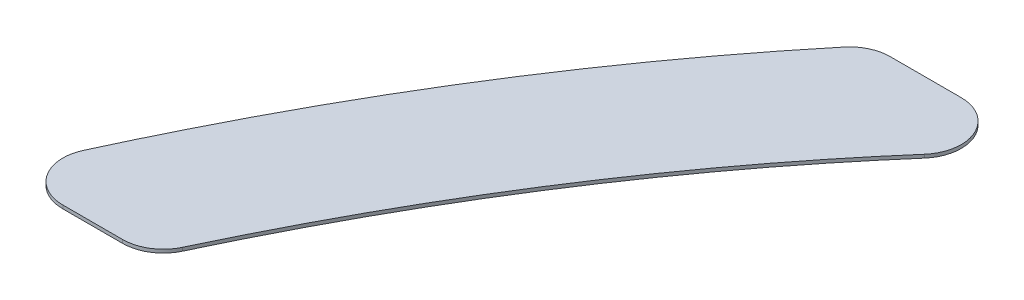
ISO-10303-21;
HEADER;
FILE_DESCRIPTION(('STEP AP214'),'2;1');
FILE_NAME('part.step','',(''),(''),'','','');
FILE_SCHEMA(('AUTOMOTIVE_DESIGN { 1 0 10303 214 1 1 1 1 }'));
ENDSEC;
DATA;
#1=APPLICATION_CONTEXT('core data for automotive mechanical design processes');
#2=APPLICATION_PROTOCOL_DEFINITION('international standard','automotive_design',2000,#1);
#3=PRODUCT_CONTEXT('',#1,'mechanical');
#4=PRODUCT('Part','Part','',(#3));
#5=PRODUCT_RELATED_PRODUCT_CATEGORY('part','',(#4));
#6=PRODUCT_DEFINITION_FORMATION('','',#4);
#7=PRODUCT_DEFINITION_CONTEXT('part definition',#1,'design');
#8=PRODUCT_DEFINITION('design','',#6,#7);
#9=PRODUCT_DEFINITION_SHAPE('','',#8);
#10=(LENGTH_UNIT() NAMED_UNIT(*) SI_UNIT(.MILLI.,.METRE.));
#11=(NAMED_UNIT(*) PLANE_ANGLE_UNIT() SI_UNIT($,.RADIAN.));
#12=(NAMED_UNIT(*) SI_UNIT($,.STERADIAN.) SOLID_ANGLE_UNIT());
#13=UNCERTAINTY_MEASURE_WITH_UNIT(LENGTH_MEASURE(1.E-05),#10,'distance_accuracy_value','');
#14=(GEOMETRIC_REPRESENTATION_CONTEXT(3) GLOBAL_UNCERTAINTY_ASSIGNED_CONTEXT((#13)) GLOBAL_UNIT_ASSIGNED_CONTEXT((#10,
#11,#12)) REPRESENTATION_CONTEXT('',''));
#15=CARTESIAN_POINT('',(0.,0.,0.));
#16=DIRECTION('',(0.,0.,1.));
#17=DIRECTION('',(1.,0.,0.));
#18=AXIS2_PLACEMENT_3D('',#15,#16,#17);
#19=CARTESIAN_POINT('',(955.237576402872,505.5,-738.));
#20=DIRECTION('',(0.,1.,0.));
#21=DIRECTION('',(0.,0.,1.));
#22=AXIS2_PLACEMENT_3D('',#19,#20,#21);
#23=CYLINDRICAL_SURFACE('',#22,12.);
#24=CARTESIAN_POINT('',(955.237576402872,505.,-738.));
#25=DIRECTION('',(0.,-1.,0.));
#26=DIRECTION('',(0.,0.,1.));
#27=AXIS2_PLACEMENT_3D('',#24,#25,#26);
#28=CIRCLE('',#27,12.);
#29=CARTESIAN_POINT('',(945.985939721077,505.,-745.642461560785));
#30=VERTEX_POINT('',#29);
#31=CARTESIAN_POINT('',(955.237576402872,505.,-750.));
#32=VERTEX_POINT('',#31);
#33=EDGE_CURVE('E30',#30,#32,#28,.T.);
#34=ORIENTED_EDGE('',*,*,#33,.F.);
#35=DIRECTION('',(0.,-1.,0.));
#36=VECTOR('',#35,1.);
#37=CARTESIAN_POINT('',(945.985939721077,506.,-745.642461560785));
#38=LINE('',#37,#36);
#39=CARTESIAN_POINT('',(945.985939721077,506.,-745.642461560785));
#40=VERTEX_POINT('',#39);
#41=EDGE_CURVE('E128',#40,#30,#38,.T.);
#42=ORIENTED_EDGE('',*,*,#41,.F.);
#43=CARTESIAN_POINT('',(955.237576402872,506.,-738.));
#44=DIRECTION('',(0.,1.,0.));
#45=DIRECTION('',(0.,0.,1.));
#46=AXIS2_PLACEMENT_3D('',#43,#44,#45);
#47=CIRCLE('',#46,12.);
#48=CARTESIAN_POINT('',(955.237576402872,506.,-750.));
#49=VERTEX_POINT('',#48);
#50=EDGE_CURVE('E170',#49,#40,#47,.T.);
#51=ORIENTED_EDGE('',*,*,#50,.F.);
#52=DIRECTION('',(0.,1.,0.));
#53=VECTOR('',#52,1.);
#54=CARTESIAN_POINT('',(955.237576402872,505.,-750.));
#55=LINE('',#54,#53);
#56=EDGE_CURVE('E163',#32,#49,#55,.T.);
#57=ORIENTED_EDGE('',*,*,#56,.F.);
#58=EDGE_LOOP('',(#34,#42,#51,#57));
#59=FACE_BOUND('',#58,.T.);
#60=ADVANCED_FACE('F17',(#59),#23,.T.);
#61=CARTESIAN_POINT('',(976.208661184801,505.5,-738.));
#62=DIRECTION('',(0.,1.,0.));
#63=DIRECTION('',(0.,0.,1.));
#64=AXIS2_PLACEMENT_3D('',#61,#62,#63);
#65=CYLINDRICAL_SURFACE('',#64,12.);
#66=CARTESIAN_POINT('',(976.208661184801,505.,-738.));
#67=DIRECTION('',(0.,-1.,0.));
#68=DIRECTION('',(0.,0.,1.));
#69=AXIS2_PLACEMENT_3D('',#66,#67,#68);
#70=CIRCLE('',#69,12.);
#71=CARTESIAN_POINT('',(976.208661184801,505.,-750.));
#72=VERTEX_POINT('',#71);
#73=CARTESIAN_POINT('',(985.265058399663,505.,-730.127156200797));
#74=VERTEX_POINT('',#73);
#75=EDGE_CURVE('E11',#72,#74,#70,.T.);
#76=ORIENTED_EDGE('',*,*,#75,.F.);
#77=DIRECTION('',(0.,-1.,0.));
#78=VECTOR('',#77,1.);
#79=CARTESIAN_POINT('',(976.208661184801,505.,-750.));
#80=LINE('',#79,#78);
#81=CARTESIAN_POINT('',(976.208661184801,506.,-750.));
#82=VERTEX_POINT('',#81);
#83=EDGE_CURVE('E174',#82,#72,#80,.T.);
#84=ORIENTED_EDGE('',*,*,#83,.F.);
#85=CARTESIAN_POINT('',(976.208661184801,506.,-738.));
#86=DIRECTION('',(0.,1.,0.));
#87=DIRECTION('',(0.,0.,1.));
#88=AXIS2_PLACEMENT_3D('',#85,#86,#87);
#89=CIRCLE('',#88,12.);
#90=CARTESIAN_POINT('',(985.265058399663,506.,-730.127156200797));
#91=VERTEX_POINT('',#90);
#92=EDGE_CURVE('E144',#91,#82,#89,.T.);
#93=ORIENTED_EDGE('',*,*,#92,.F.);
#94=DIRECTION('',(0.,1.,0.));
#95=VECTOR('',#94,1.);
#96=CARTESIAN_POINT('',(985.265058399663,505.,-730.127156200797));
#97=LINE('',#96,#95);
#98=EDGE_CURVE('E145',#74,#91,#97,.T.);
#99=ORIENTED_EDGE('',*,*,#98,.F.);
#100=EDGE_LOOP('',(#76,#84,#93,#99));
#101=FACE_BOUND('',#100,.T.);
#102=ADVANCED_FACE('F220',(#101),#65,.T.);
#103=CARTESIAN_POINT('',(871.073432562076,505.5,-602.));
#104=DIRECTION('',(0.,1.,0.));
#105=DIRECTION('',(0.,0.,1.));
#106=AXIS2_PLACEMENT_3D('',#103,#104,#105);
#107=CYLINDRICAL_SURFACE('',#106,12.);
#108=CARTESIAN_POINT('',(871.073432562076,505.,-602.));
#109=DIRECTION('',(0.,-1.,0.));
#110=DIRECTION('',(0.,0.,1.));
#111=AXIS2_PLACEMENT_3D('',#108,#109,#110);
#112=CIRCLE('',#111,12.);
#113=CARTESIAN_POINT('',(871.073432562076,505.,-590.));
#114=VERTEX_POINT('',#113);
#115=CARTESIAN_POINT('',(860.166764917188,505.,-607.004458100929));
#116=VERTEX_POINT('',#115);
#117=EDGE_CURVE('E110',#114,#116,#112,.T.);
#118=ORIENTED_EDGE('',*,*,#117,.F.);
#119=DIRECTION('',(0.,-1.,0.));
#120=VECTOR('',#119,1.);
#121=CARTESIAN_POINT('',(871.073432562076,505.,-590.));
#122=LINE('',#121,#120);
#123=CARTESIAN_POINT('',(871.073432562076,506.,-590.));
#124=VERTEX_POINT('',#123);
#125=EDGE_CURVE('E126',#124,#114,#122,.T.);
#126=ORIENTED_EDGE('',*,*,#125,.F.);
#127=CARTESIAN_POINT('',(871.073432562076,506.,-602.));
#128=DIRECTION('',(0.,1.,0.));
#129=DIRECTION('',(0.,0.,1.));
#130=AXIS2_PLACEMENT_3D('',#127,#128,#129);
#131=CIRCLE('',#130,12.);
#132=CARTESIAN_POINT('',(860.166764917188,506.,-607.00445810093));
#133=VERTEX_POINT('',#132);
#134=EDGE_CURVE('E111',#133,#124,#131,.T.);
#135=ORIENTED_EDGE('',*,*,#134,.F.);
#136=DIRECTION('',(0.,1.,0.));
#137=VECTOR('',#136,1.);
#138=CARTESIAN_POINT('',(860.166764917188,505.,-607.00445810093));
#139=LINE('',#138,#137);
#140=EDGE_CURVE('E155',#116,#133,#139,.T.);
#141=ORIENTED_EDGE('',*,*,#140,.F.);
#142=EDGE_LOOP('',(#118,#126,#135,#141));
#143=FACE_BOUND('',#142,.T.);
#144=ADVANCED_FACE('F215',(#143),#107,.T.);
#145=CARTESIAN_POINT('',(888.719576178788,505.5,-602.));
#146=DIRECTION('',(0.,1.,0.));
#147=DIRECTION('',(0.,0.,1.));
#148=AXIS2_PLACEMENT_3D('',#145,#146,#147);
#149=CYLINDRICAL_SURFACE('',#148,12.);
#150=CARTESIAN_POINT('',(888.719576178788,505.,-602.));
#151=DIRECTION('',(0.,-1.,0.));
#152=DIRECTION('',(0.,0.,1.));
#153=AXIS2_PLACEMENT_3D('',#150,#151,#152);
#154=CIRCLE('',#153,12.);
#155=CARTESIAN_POINT('',(899.573311030838,505.,-596.881754230071));
#156=VERTEX_POINT('',#155);
#157=CARTESIAN_POINT('',(888.719576178788,505.,-590.));
#158=VERTEX_POINT('',#157);
#159=EDGE_CURVE('E99',#156,#158,#154,.T.);
#160=ORIENTED_EDGE('',*,*,#159,.F.);
#161=DIRECTION('',(0.,-1.,0.));
#162=VECTOR('',#161,1.);
#163=CARTESIAN_POINT('',(899.573311030838,506.,-596.881754230071));
#164=LINE('',#163,#162);
#165=CARTESIAN_POINT('',(899.573311030838,506.,-596.881754230071));
#166=VERTEX_POINT('',#165);
#167=EDGE_CURVE('E139',#166,#156,#164,.T.);
#168=ORIENTED_EDGE('',*,*,#167,.F.);
#169=CARTESIAN_POINT('',(888.719576178788,506.,-602.));
#170=DIRECTION('',(0.,1.,0.));
#171=DIRECTION('',(0.,0.,1.));
#172=AXIS2_PLACEMENT_3D('',#169,#170,#171);
#173=CIRCLE('',#172,12.);
#174=CARTESIAN_POINT('',(888.719576178788,506.,-590.));
#175=VERTEX_POINT('',#174);
#176=EDGE_CURVE('E116',#175,#166,#173,.T.);
#177=ORIENTED_EDGE('',*,*,#176,.F.);
#178=DIRECTION('',(0.,1.,0.));
#179=VECTOR('',#178,1.);
#180=CARTESIAN_POINT('',(888.719576178788,505.,-590.));
#181=LINE('',#180,#179);
#182=EDGE_CURVE('E114',#158,#175,#181,.T.);
#183=ORIENTED_EDGE('',*,*,#182,.F.);
#184=EDGE_LOOP('',(#160,#168,#177,#183));
#185=FACE_BOUND('',#184,.T.);
#186=ADVANCED_FACE('F115',(#185),#149,.T.);
#187=CARTESIAN_POINT('',(0.,505.,0.));
#188=DIRECTION('',(0.,1.,0.));
#189=DIRECTION('',(1.,0.,0.));
#190=AXIS2_PLACEMENT_3D('',#187,#188,#189);
#191=PLANE('',#190);
#192=CARTESIAN_POINT('',(825.006522365139,505.,-344.676532488364));
#193=CARTESIAN_POINT('',(825.502071576371,505.,-347.609970859946));
#194=CARTESIAN_POINT('',(826.514492213466,505.,-353.489713475438));
#195=CARTESIAN_POINT('',(828.273533808435,505.,-363.324582214981));
#196=CARTESIAN_POINT('',(830.651391723599,505.,-376.045663642099));
#197=CARTESIAN_POINT('',(833.747456429881,505.,-391.621543043858));
#198=CARTESIAN_POINT('',(837.483450045872,505.,-409.103183332899));
#199=CARTESIAN_POINT('',(841.486505540497,505.,-426.544472916345));
#200=CARTESIAN_POINT('',(845.774013518538,505.,-443.954609379996));
#201=CARTESIAN_POINT('',(851.105430867338,505.,-464.155658786559));
#202=CARTESIAN_POINT('',(861.558508139477,505.,-500.521160412346));
#203=CARTESIAN_POINT('',(872.863834634074,505.,-533.518021096127));
#204=CARTESIAN_POINT('',(883.558054688417,505.,-560.331774609759));
#205=CARTESIAN_POINT('',(887.357800806862,505.,-569.541557639466));
#206=CARTESIAN_POINT('',(892.477568878219,505.,-581.473019758271));
#207=CARTESIAN_POINT('',(900.72435084607,505.,-599.640127057022));
#208=CARTESIAN_POINT('',(910.490682875014,505.,-619.304553189258));
#209=CARTESIAN_POINT('',(923.844740427881,505.,-643.841311183101));
#210=CARTESIAN_POINT('',(939.320335597391,505.,-669.51622660218));
#211=CARTESIAN_POINT('',(956.39364097684,505.,-694.171473634577));
#212=CARTESIAN_POINT('',(977.346769521141,505.,-721.399321829088));
#213=CARTESIAN_POINT('',(992.105926782801,505.,-738.23099025863));
#214=CARTESIAN_POINT('',(1003.47790187698,505.,-750.));
#215=B_SPLINE_CURVE_WITH_KNOTS('',3,(#192,#193,#194,#195,#196,#197,#198,#199,#200,#201,#202,
#203,#204,#205,#206,#207,#208,#209,#210,#211,#212,#213,#214),.UNSPECIFIED.,.F.,.F.,(4,1,1,1,1,1,
1,1,1,1,1,1,1,1,1,1,1,1,1,1,4),(0.,0.0198469540453557,0.0398023279099142,0.0666516046742607,
0.106181617890233,0.145742806752709,0.185906782046108,0.225557415669375,0.265358061934929,
0.325279072167063,0.477967126125197,0.49787596302009,0.517837003226265,0.544435965517352,
0.584485936496442,0.650928780005736,0.690868861182268,0.770831386087473,0.850825035250476,
0.890825141233141,1.),.UNSPECIFIED.);
#216=EDGE_CURVE('E105',#156,#74,#215,.T.);
#217=ORIENTED_EDGE('',*,*,#216,.F.);
#218=ORIENTED_EDGE('',*,*,#159,.T.);
#219=DIRECTION('',(1.,0.,0.));
#220=VECTOR('',#219,1.);
#221=CARTESIAN_POINT('',(0.,505.,-590.));
#222=LINE('',#221,#220);
#223=EDGE_CURVE('E103',#114,#158,#222,.T.);
#224=ORIENTED_EDGE('',*,*,#223,.F.);
#225=ORIENTED_EDGE('',*,*,#117,.T.);
#226=CARTESIAN_POINT('',(949.622839074963,505.,-750.));
#227=CARTESIAN_POINT('',(948.181651482879,505.,-748.290896013329));
#228=CARTESIAN_POINT('',(943.517373824289,505.,-742.692036027472));
#229=CARTESIAN_POINT('',(935.596348013565,505.,-732.796931963177));
#230=CARTESIAN_POINT('',(927.357452401453,505.,-721.903253368827));
#231=CARTESIAN_POINT('',(920.439413386482,505.,-712.320573569399));
#232=CARTESIAN_POINT('',(915.533414579631,505.,-705.283306887266));
#233=CARTESIAN_POINT('',(910.730648345717,505.,-698.191566717435));
#234=CARTESIAN_POINT('',(906.026129482516,505.,-691.040701027744));
#235=CARTESIAN_POINT('',(900.870928336081,505.,-682.928791147231));
#236=CARTESIAN_POINT('',(895.844019837568,505.,-674.741572245518));
#237=CARTESIAN_POINT('',(890.950116031723,505.,-666.49211748031));
#238=CARTESIAN_POINT('',(883.021464626893,505.,-652.65793836365));
#239=CARTESIAN_POINT('',(875.732647086845,505.,-639.028907763579));
#240=CARTESIAN_POINT('',(864.878708233502,505.,-617.371719998699));
#241=CARTESIAN_POINT('',(854.705502760165,505.,-595.38274812104));
#242=CARTESIAN_POINT('',(845.299994293779,505.,-572.580742200096));
#243=CARTESIAN_POINT('',(839.606242102918,505.,-557.816290796022));
#244=CARTESIAN_POINT('',(835.961614997108,505.,-548.041779910277));
#245=CARTESIAN_POINT('',(831.386466490733,505.,-535.280580154532));
#246=CARTESIAN_POINT('',(826.037331500085,505.,-519.493232672379));
#247=CARTESIAN_POINT('',(821.013206386271,505.,-503.624479559208));
#248=CARTESIAN_POINT('',(816.258267212226,505.,-487.736915010618));
#249=CARTESIAN_POINT('',(811.756904933394,505.,-471.814735959559));
#250=CARTESIAN_POINT('',(807.010345899914,505.,-453.831651078258));
#251=CARTESIAN_POINT('',(802.080298613391,505.,-433.808652235915));
#252=CARTESIAN_POINT('',(794.359907220215,505.,-399.763628532244));
#253=CARTESIAN_POINT('',(788.978424366858,505.,-371.541131576573));
#254=CARTESIAN_POINT('',(785.565207915593,505.,-351.339849535134));
#255=B_SPLINE_CURVE_WITH_KNOTS('',3,(#226,#227,#228,#229,#230,#231,#232,#233,#234,#235,#236,
#237,#238,#239,#240,#241,#242,#243,#244,#245,#246,#247,#248,#249,#250,#251,#252,#253,#254),
.UNSPECIFIED.,.F.,.F.,(4,1,1,1,1,1,1,1,1,1,1,1,1,1,1,1,1,1,1,1,1,1,1,1,1,1,4),(0.,
0.0153730172607203,0.0501082754430755,0.0871494370808145,0.109283291758605,0.13137673213412,
0.146136713436848,0.168178546545651,0.190233860885721,0.212226287351009,0.234239639403898,
0.256189399818794,0.321867021644385,0.340492047006871,0.422764878086934,0.488417785530368,
0.51007380936891,0.531576010009929,0.560150427553378,0.603290898391669,0.646191391927847,
0.674602494027159,0.717325147157775,0.759964645375679,0.802490674331181,0.859118163454199,1.),.UNSPECIFIED.);
#256=EDGE_CURVE('E21',#30,#116,#255,.T.);
#257=ORIENTED_EDGE('',*,*,#256,.F.);
#258=ORIENTED_EDGE('',*,*,#33,.T.);
#259=DIRECTION('',(-1.,0.,0.));
#260=VECTOR('',#259,1.);
#261=CARTESIAN_POINT('',(0.,505.,-750.));
#262=LINE('',#261,#260);
#263=EDGE_CURVE('E167',#72,#32,#262,.T.);
#264=ORIENTED_EDGE('',*,*,#263,.F.);
#265=ORIENTED_EDGE('',*,*,#75,.T.);
#266=EDGE_LOOP('',(#217,#218,#224,#225,#257,#258,#264,#265));
#267=FACE_BOUND('',#266,.T.);
#268=ADVANCED_FACE('F101',(#267),#191,.F.);
#269=CARTESIAN_POINT('',(0.,506.,0.));
#270=DIRECTION('',(0.,1.,0.));
#271=DIRECTION('',(1.,0.,0.));
#272=AXIS2_PLACEMENT_3D('',#269,#270,#271);
#273=PLANE('',#272);
#274=DIRECTION('',(1.,0.,0.));
#275=VECTOR('',#274,1.);
#276=CARTESIAN_POINT('',(0.,506.,-590.));
#277=LINE('',#276,#275);
#278=EDGE_CURVE('E121',#124,#175,#277,.T.);
#279=ORIENTED_EDGE('',*,*,#278,.T.);
#280=ORIENTED_EDGE('',*,*,#176,.T.);
#281=CARTESIAN_POINT('',(825.006522365139,506.,-344.676532488364));
#282=CARTESIAN_POINT('',(825.502071576371,506.,-347.609970859946));
#283=CARTESIAN_POINT('',(826.514492213466,506.,-353.489713475438));
#284=CARTESIAN_POINT('',(828.273533808435,506.,-363.324582214981));
#285=CARTESIAN_POINT('',(830.651391723599,506.,-376.045663642099));
#286=CARTESIAN_POINT('',(833.747456429881,506.,-391.621543043858));
#287=CARTESIAN_POINT('',(837.483450045872,506.,-409.103183332899));
#288=CARTESIAN_POINT('',(841.486505540497,506.,-426.544472916345));
#289=CARTESIAN_POINT('',(845.774013518538,506.,-443.954609379996));
#290=CARTESIAN_POINT('',(851.105430867338,506.,-464.155658786559));
#291=CARTESIAN_POINT('',(861.558508139477,506.,-500.521160412346));
#292=CARTESIAN_POINT('',(872.863834634074,506.,-533.518021096127));
#293=CARTESIAN_POINT('',(883.558054688417,506.,-560.331774609759));
#294=CARTESIAN_POINT('',(887.357800806862,506.,-569.541557639466));
#295=CARTESIAN_POINT('',(892.477568878219,506.,-581.473019758271));
#296=CARTESIAN_POINT('',(900.72435084607,506.,-599.640127057022));
#297=CARTESIAN_POINT('',(910.490682875014,506.,-619.304553189258));
#298=CARTESIAN_POINT('',(923.844740427881,506.,-643.841311183101));
#299=CARTESIAN_POINT('',(939.320335597391,506.,-669.51622660218));
#300=CARTESIAN_POINT('',(956.39364097684,506.,-694.171473634577));
#301=CARTESIAN_POINT('',(977.346769521141,506.,-721.399321829088));
#302=CARTESIAN_POINT('',(992.105926782801,506.,-738.23099025863));
#303=CARTESIAN_POINT('',(1003.47790187698,506.,-750.));
#304=B_SPLINE_CURVE_WITH_KNOTS('',3,(#281,#282,#283,#284,#285,#286,#287,#288,#289,#290,#291,
#292,#293,#294,#295,#296,#297,#298,#299,#300,#301,#302,#303),.UNSPECIFIED.,.F.,.F.,(4,1,1,1,1,1,
1,1,1,1,1,1,1,1,1,1,1,1,1,1,4),(0.,0.0198469540453557,0.0398023279099142,0.0666516046742607,
0.106181617890233,0.145742806752709,0.185906782046108,0.225557415669375,0.265358061934929,
0.325279072167063,0.477967126125197,0.49787596302009,0.517837003226265,0.544435965517352,
0.584485936496442,0.650928780005736,0.690868861182268,0.770831386087473,0.850825035250476,
0.890825141233141,1.),.UNSPECIFIED.);
#305=EDGE_CURVE('E142',#166,#91,#304,.T.);
#306=ORIENTED_EDGE('',*,*,#305,.T.);
#307=ORIENTED_EDGE('',*,*,#92,.T.);
#308=DIRECTION('',(-1.,0.,0.));
#309=VECTOR('',#308,1.);
#310=CARTESIAN_POINT('',(0.,506.,-750.));
#311=LINE('',#310,#309);
#312=EDGE_CURVE('E175',#82,#49,#311,.T.);
#313=ORIENTED_EDGE('',*,*,#312,.T.);
#314=ORIENTED_EDGE('',*,*,#50,.T.);
#315=CARTESIAN_POINT('',(949.622839074963,506.,-750.));
#316=CARTESIAN_POINT('',(948.181651482879,506.,-748.290896013329));
#317=CARTESIAN_POINT('',(943.517373824289,506.,-742.692036027472));
#318=CARTESIAN_POINT('',(935.596348013565,506.,-732.796931963177));
#319=CARTESIAN_POINT('',(927.357452401453,506.,-721.903253368827));
#320=CARTESIAN_POINT('',(920.439413386482,506.,-712.320573569399));
#321=CARTESIAN_POINT('',(915.533414579631,506.,-705.283306887266));
#322=CARTESIAN_POINT('',(910.730648345717,506.,-698.191566717435));
#323=CARTESIAN_POINT('',(906.026129482516,506.,-691.040701027744));
#324=CARTESIAN_POINT('',(900.870928336081,506.,-682.928791147231));
#325=CARTESIAN_POINT('',(895.844019837568,506.,-674.741572245518));
#326=CARTESIAN_POINT('',(890.950116031723,506.,-666.49211748031));
#327=CARTESIAN_POINT('',(883.021464626893,506.,-652.65793836365));
#328=CARTESIAN_POINT('',(875.732647086845,506.,-639.028907763579));
#329=CARTESIAN_POINT('',(864.878708233502,506.,-617.371719998699));
#330=CARTESIAN_POINT('',(854.705502760165,506.,-595.38274812104));
#331=CARTESIAN_POINT('',(845.299994293779,506.,-572.580742200096));
#332=CARTESIAN_POINT('',(839.606242102918,506.,-557.816290796022));
#333=CARTESIAN_POINT('',(835.961614997108,506.,-548.041779910277));
#334=CARTESIAN_POINT('',(831.386466490733,506.,-535.280580154532));
#335=CARTESIAN_POINT('',(826.037331500085,506.,-519.493232672379));
#336=CARTESIAN_POINT('',(821.013206386271,506.,-503.624479559208));
#337=CARTESIAN_POINT('',(816.258267212226,506.,-487.736915010618));
#338=CARTESIAN_POINT('',(811.756904933394,506.,-471.814735959559));
#339=CARTESIAN_POINT('',(807.010345899914,506.,-453.831651078258));
#340=CARTESIAN_POINT('',(802.080298613391,506.,-433.808652235915));
#341=CARTESIAN_POINT('',(794.359907220215,506.,-399.763628532244));
#342=CARTESIAN_POINT('',(788.978424366858,506.,-371.541131576573));
#343=CARTESIAN_POINT('',(785.565207915593,506.,-351.339849535134));
#344=B_SPLINE_CURVE_WITH_KNOTS('',3,(#315,#316,#317,#318,#319,#320,#321,#322,#323,#324,#325,
#326,#327,#328,#329,#330,#331,#332,#333,#334,#335,#336,#337,#338,#339,#340,#341,#342,#343),
.UNSPECIFIED.,.F.,.F.,(4,1,1,1,1,1,1,1,1,1,1,1,1,1,1,1,1,1,1,1,1,1,1,1,1,1,4),(0.,
0.0153730172607203,0.0501082754430755,0.0871494370808145,0.109283291758605,0.13137673213412,
0.146136713436848,0.168178546545651,0.190233860885721,0.212226287351009,0.234239639403898,
0.256189399818794,0.321867021644385,0.340492047006871,0.422764878086934,0.488417785530368,
0.51007380936891,0.531576010009929,0.560150427553378,0.603290898391669,0.646191391927847,
0.674602494027159,0.717325147157775,0.759964645375679,0.802490674331181,0.859118163454199,1.),.UNSPECIFIED.);
#345=EDGE_CURVE('E135',#40,#133,#344,.T.);
#346=ORIENTED_EDGE('',*,*,#345,.T.);
#347=ORIENTED_EDGE('',*,*,#134,.T.);
#348=EDGE_LOOP('',(#279,#280,#306,#307,#313,#314,#346,#347));
#349=FACE_BOUND('',#348,.T.);
#350=ADVANCED_FACE('F19',(#349),#273,.T.);
#351=CARTESIAN_POINT('',(1003.47790187698,505.,-750.));
#352=CARTESIAN_POINT('',(992.105926782801,505.,-738.23099025863));
#353=CARTESIAN_POINT('',(977.346769521141,505.,-721.399321829088));
#354=CARTESIAN_POINT('',(956.39364097684,505.,-694.171473634577));
#355=CARTESIAN_POINT('',(939.320335597391,505.,-669.51622660218));
#356=CARTESIAN_POINT('',(923.844740427881,505.,-643.841311183101));
#357=CARTESIAN_POINT('',(910.490682875014,505.,-619.304553189258));
#358=CARTESIAN_POINT('',(900.72435084607,505.,-599.640127057022));
#359=CARTESIAN_POINT('',(892.477568878219,505.,-581.473019758271));
#360=CARTESIAN_POINT('',(887.357800806862,505.,-569.541557639466));
#361=CARTESIAN_POINT('',(883.558054688417,505.,-560.331774609759));
#362=CARTESIAN_POINT('',(872.863834634074,505.,-533.518021096127));
#363=CARTESIAN_POINT('',(861.558508139477,505.,-500.521160412346));
#364=CARTESIAN_POINT('',(851.105430867338,505.,-464.155658786559));
#365=CARTESIAN_POINT('',(845.774013518538,505.,-443.954609379996));
#366=CARTESIAN_POINT('',(841.486505540497,505.,-426.544472916345));
#367=CARTESIAN_POINT('',(837.483450045872,505.,-409.103183332899));
#368=CARTESIAN_POINT('',(833.747456429881,505.,-391.621543043858));
#369=CARTESIAN_POINT('',(830.651391723599,505.,-376.045663642099));
#370=CARTESIAN_POINT('',(828.273533808435,505.,-363.324582214981));
#371=CARTESIAN_POINT('',(826.514492213466,505.,-353.489713475438));
#372=CARTESIAN_POINT('',(825.502071576371,505.,-347.609970859946));
#373=CARTESIAN_POINT('',(825.006522365139,505.,-344.676532488364));
#374=(BOUNDED_CURVE() B_SPLINE_CURVE(3,(#351,#352,#353,#354,#355,#356,#357,#358,#359,#360,#361,
#362,#363,#364,#365,#366,#367,#368,#369,#370,#371,#372,#373),.UNSPECIFIED.,.F.,
.F.) B_SPLINE_CURVE_WITH_KNOTS((4,1,1,1,1,1,1,1,1,1,1,1,1,1,1,1,1,1,1,1,4),(0.,
0.109174858766859,0.149174964749524,0.229168613912527,0.309131138817732,0.349071219994264,
0.415514063503558,0.455564034482648,0.482162996773735,0.50212403697991,0.522032873874803,
0.674720927832937,0.734641938065071,0.774442584330625,0.814093217953892,0.854257193247291,
0.893818382109767,0.933348395325739,0.960197672090086,0.980153045954644,1.),
.UNSPECIFIED.) CURVE() GEOMETRIC_REPRESENTATION_ITEM() RATIONAL_B_SPLINE_CURVE((1.,1.,1.,1.,1.,
1.,1.,1.,1.,1.,1.,1.,1.,1.,1.,1.,1.,1.,1.,1.,1.,1.,1.)) REPRESENTATION_ITEM(''));
#375=DIRECTION('',(0.,1.,0.));
#376=VECTOR('',#375,1.);
#377=SURFACE_OF_LINEAR_EXTRUSION('',#374,#376);
#378=ORIENTED_EDGE('',*,*,#305,.F.);
#379=ORIENTED_EDGE('',*,*,#167,.T.);
#380=ORIENTED_EDGE('',*,*,#216,.T.);
#381=ORIENTED_EDGE('',*,*,#98,.T.);
#382=EDGE_LOOP('',(#378,#379,#380,#381));
#383=FACE_BOUND('',#382,.T.);
#384=ADVANCED_FACE('F218',(#383),#377,.F.);
#385=CARTESIAN_POINT('',(0.,505.,-590.));
#386=DIRECTION('',(0.,0.,-1.));
#387=DIRECTION('',(0.,-1.,0.));
#388=AXIS2_PLACEMENT_3D('',#385,#386,#387);
#389=PLANE('',#388);
#390=ORIENTED_EDGE('',*,*,#223,.T.);
#391=ORIENTED_EDGE('',*,*,#182,.T.);
#392=ORIENTED_EDGE('',*,*,#278,.F.);
#393=ORIENTED_EDGE('',*,*,#125,.T.);
#394=EDGE_LOOP('',(#390,#391,#392,#393));
#395=FACE_BOUND('',#394,.T.);
#396=ADVANCED_FACE('F124',(#395),#389,.F.);
#397=CARTESIAN_POINT('',(949.622839074963,505.,-750.));
#398=CARTESIAN_POINT('',(948.181651482879,505.,-748.290896013329));
#399=CARTESIAN_POINT('',(943.517373824289,505.,-742.692036027472));
#400=CARTESIAN_POINT('',(935.596348013565,505.,-732.796931963177));
#401=CARTESIAN_POINT('',(927.357452401453,505.,-721.903253368827));
#402=CARTESIAN_POINT('',(920.439413386482,505.,-712.320573569399));
#403=CARTESIAN_POINT('',(915.533414579631,505.,-705.283306887266));
#404=CARTESIAN_POINT('',(910.730648345717,505.,-698.191566717435));
#405=CARTESIAN_POINT('',(906.026129482516,505.,-691.040701027744));
#406=CARTESIAN_POINT('',(900.870928336081,505.,-682.928791147231));
#407=CARTESIAN_POINT('',(895.844019837568,505.,-674.741572245518));
#408=CARTESIAN_POINT('',(890.950116031723,505.,-666.49211748031));
#409=CARTESIAN_POINT('',(883.021464626893,505.,-652.65793836365));
#410=CARTESIAN_POINT('',(875.732647086845,505.,-639.028907763579));
#411=CARTESIAN_POINT('',(864.878708233502,505.,-617.371719998699));
#412=CARTESIAN_POINT('',(854.705502760165,505.,-595.38274812104));
#413=CARTESIAN_POINT('',(845.299994293779,505.,-572.580742200096));
#414=CARTESIAN_POINT('',(839.606242102918,505.,-557.816290796022));
#415=CARTESIAN_POINT('',(835.961614997108,505.,-548.041779910277));
#416=CARTESIAN_POINT('',(831.386466490733,505.,-535.280580154532));
#417=CARTESIAN_POINT('',(826.037331500085,505.,-519.493232672379));
#418=CARTESIAN_POINT('',(821.013206386271,505.,-503.624479559208));
#419=CARTESIAN_POINT('',(816.258267212226,505.,-487.736915010618));
#420=CARTESIAN_POINT('',(811.756904933394,505.,-471.814735959559));
#421=CARTESIAN_POINT('',(807.010345899914,505.,-453.831651078258));
#422=CARTESIAN_POINT('',(802.080298613391,505.,-433.808652235915));
#423=CARTESIAN_POINT('',(794.359907220215,505.,-399.763628532244));
#424=CARTESIAN_POINT('',(788.978424366858,505.,-371.541131576573));
#425=CARTESIAN_POINT('',(785.565207915593,505.,-351.339849535134));
#426=(BOUNDED_CURVE() B_SPLINE_CURVE(3,(#397,#398,#399,#400,#401,#402,#403,#404,#405,#406,#407,
#408,#409,#410,#411,#412,#413,#414,#415,#416,#417,#418,#419,#420,#421,#422,#423,#424,#425),
.UNSPECIFIED.,.F.,.F.) B_SPLINE_CURVE_WITH_KNOTS((4,1,1,1,1,1,1,1,1,1,1,1,1,1,1,1,1,1,1,1,1,1,1,
1,1,1,4),(0.,0.0153730172607203,0.0501082754430755,0.0871494370808145,0.109283291758605,
0.13137673213412,0.146136713436848,0.168178546545651,0.190233860885721,0.212226287351009,
0.234239639403898,0.256189399818794,0.321867021644385,0.340492047006871,0.422764878086934,
0.488417785530368,0.51007380936891,0.531576010009929,0.560150427553378,0.603290898391669,
0.646191391927847,0.674602494027159,0.717325147157775,0.759964645375679,0.802490674331181,
0.859118163454199,1.),
.UNSPECIFIED.) CURVE() GEOMETRIC_REPRESENTATION_ITEM() RATIONAL_B_SPLINE_CURVE((1.,1.,1.,1.,1.,
1.,1.,1.,1.,1.,1.,1.,1.,1.,1.,1.,1.,1.,1.,1.,1.,1.,1.,1.,1.,1.,1.,1.,1.)) REPRESENTATION_ITEM(''));
#427=DIRECTION('',(0.,1.,0.));
#428=VECTOR('',#427,1.);
#429=SURFACE_OF_LINEAR_EXTRUSION('',#426,#428);
#430=ORIENTED_EDGE('',*,*,#256,.T.);
#431=ORIENTED_EDGE('',*,*,#140,.T.);
#432=ORIENTED_EDGE('',*,*,#345,.F.);
#433=ORIENTED_EDGE('',*,*,#41,.T.);
#434=EDGE_LOOP('',(#430,#431,#432,#433));
#435=FACE_BOUND('',#434,.T.);
#436=ADVANCED_FACE('F212',(#435),#429,.T.);
#437=CARTESIAN_POINT('',(0.,505.,-750.));
#438=DIRECTION('',(0.,0.,1.));
#439=DIRECTION('',(1.,0.,0.));
#440=AXIS2_PLACEMENT_3D('',#437,#438,#439);
#441=PLANE('',#440);
#442=ORIENTED_EDGE('',*,*,#312,.F.);
#443=ORIENTED_EDGE('',*,*,#83,.T.);
#444=ORIENTED_EDGE('',*,*,#263,.T.);
#445=ORIENTED_EDGE('',*,*,#56,.T.);
#446=EDGE_LOOP('',(#442,#443,#444,#445));
#447=FACE_BOUND('',#446,.T.);
#448=ADVANCED_FACE('F225',(#447),#441,.F.);
#449=CLOSED_SHELL('',(#60,#102,#144,#186,#268,#350,#384,#396,#436,#448));
#450=MANIFOLD_SOLID_BREP('B1',#449);
#451=ADVANCED_BREP_SHAPE_REPRESENTATION('',(#18,#450),#14);
#452=SHAPE_DEFINITION_REPRESENTATION(#9,#451);
ENDSEC;
END-ISO-10303-21;
